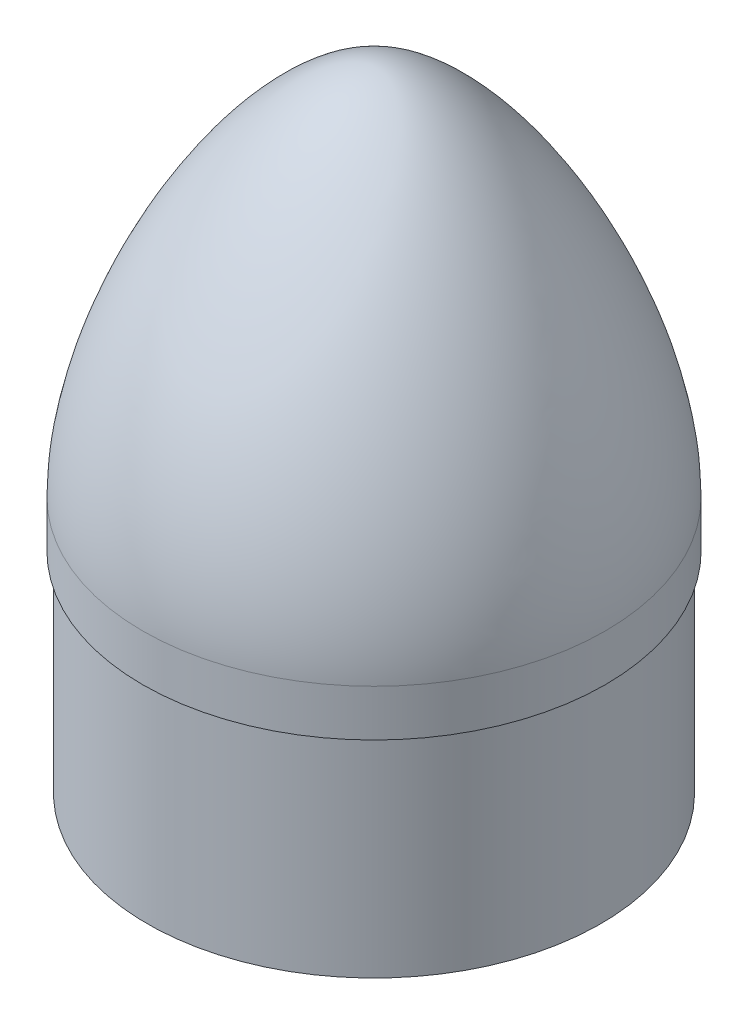
ISO-10303-21;
HEADER;
FILE_DESCRIPTION(('STEP AP214'),'2;1');
FILE_NAME('part.step','',(''),(''),'','','');
FILE_SCHEMA(('AUTOMOTIVE_DESIGN { 1 0 10303 214 1 1 1 1 }'));
ENDSEC;
DATA;
#1=APPLICATION_CONTEXT('core data for automotive mechanical design processes');
#2=APPLICATION_PROTOCOL_DEFINITION('international standard','automotive_design',2000,#1);
#3=PRODUCT_CONTEXT('',#1,'mechanical');
#4=PRODUCT('Part','Part','',(#3));
#5=PRODUCT_RELATED_PRODUCT_CATEGORY('part','',(#4));
#6=PRODUCT_DEFINITION_FORMATION('','',#4);
#7=PRODUCT_DEFINITION_CONTEXT('part definition',#1,'design');
#8=PRODUCT_DEFINITION('design','',#6,#7);
#9=PRODUCT_DEFINITION_SHAPE('','',#8);
#10=(LENGTH_UNIT() NAMED_UNIT(*) SI_UNIT(.MILLI.,.METRE.));
#11=(NAMED_UNIT(*) PLANE_ANGLE_UNIT() SI_UNIT($,.RADIAN.));
#12=(NAMED_UNIT(*) SI_UNIT($,.STERADIAN.) SOLID_ANGLE_UNIT());
#13=UNCERTAINTY_MEASURE_WITH_UNIT(LENGTH_MEASURE(1.E-05),#10,'distance_accuracy_value','');
#14=(GEOMETRIC_REPRESENTATION_CONTEXT(3) GLOBAL_UNCERTAINTY_ASSIGNED_CONTEXT((#13)) GLOBAL_UNIT_ASSIGNED_CONTEXT((#10,
#11,#12)) REPRESENTATION_CONTEXT('',''));
#15=CARTESIAN_POINT('',(0.,0.,0.));
#16=DIRECTION('',(0.,0.,1.));
#17=DIRECTION('',(1.,0.,0.));
#18=AXIS2_PLACEMENT_3D('',#15,#16,#17);
#19=CARTESIAN_POINT('',(-24.3478600957646,27.8393212982698,0.));
#20=CARTESIAN_POINT('',(-24.3414997113521,28.3460105532486,0.));
#21=CARTESIAN_POINT('',(-24.3016388325864,29.3485779649372,0.));
#22=CARTESIAN_POINT('',(-24.1158072803861,31.4318454618947,0.));
#23=CARTESIAN_POINT('',(-23.6931384789774,34.1082295346281,0.));
#24=CARTESIAN_POINT('',(-22.9070651137298,37.4074468602552,0.));
#25=CARTESIAN_POINT('',(-21.5228737091641,41.8546892857655,0.));
#26=CARTESIAN_POINT('',(-19.2301518833451,47.3921397382636,0.));
#27=CARTESIAN_POINT('',(-15.7988297499191,53.635971479426,0.));
#28=CARTESIAN_POINT('',(-11.9110093117972,59.1150642814052,0.));
#29=CARTESIAN_POINT('',(-8.48121615369774,62.7397553171536,0.));
#30=CARTESIAN_POINT('',(-5.74701573311542,64.8929955493382,0.));
#31=CARTESIAN_POINT('',(-3.73464076708142,66.0907602092129,0.));
#32=CARTESIAN_POINT('',(-2.12409342091839,66.7077991405744,0.));
#33=CARTESIAN_POINT('',(-0.885893826213247,66.9577998041921,0.));
#34=CARTESIAN_POINT('',(-0.298692976328732,67.,0.));
#35=CARTESIAN_POINT('',(0.,67.,0.));
#36=B_SPLINE_CURVE_WITH_KNOTS('',3,(#19,#20,#21,#22,#23,#24,#25,#26,#27,#28,#29,#30,#31,#32,#33,
#34,#35),.UNSPECIFIED.,.F.,.F.,(4,1,1,1,1,1,1,1,1,1,1,1,1,1,4),(0.00705350906116208,
0.0380830869030008,0.0691126647448395,0.131171820428517,0.193230976112194,0.255290131795872,
0.379408443163226,0.503526754530581,0.627645065897936,0.751763377265291,0.813822532948968,
0.875881688632645,0.937940844316323,0.968970422158161,1.),.UNSPECIFIED.);
#37=CARTESIAN_POINT('',(0.,0.,0.));
#38=DIRECTION('',(0.,-1.,0.));
#39=AXIS1_PLACEMENT('',#37,#38);
#40=SURFACE_OF_REVOLUTION('',#36,#39);
#41=CARTESIAN_POINT('',(0.,67.,0.));
#42=VERTEX_POINT('',#41);
#43=VERTEX_LOOP('',#42);
#44=FACE_BOUND('',#43,.T.);
#45=CARTESIAN_POINT('',(0.,27.8393212982698,0.));
#46=DIRECTION('',(0.,-1.,0.));
#47=DIRECTION('',(0.,0.,-1.));
#48=AXIS2_PLACEMENT_3D('',#45,#46,#47);
#49=CIRCLE('',#48,24.3478600957646);
#50=CARTESIAN_POINT('',(0.,27.8393212982698,-24.3478600957646));
#51=VERTEX_POINT('',#50);
#52=EDGE_CURVE('E59',#51,#51,#49,.T.);
#53=ORIENTED_EDGE('',*,*,#52,.T.);
#54=EDGE_LOOP('',(#53));
#55=FACE_BOUND('',#54,.T.);
#56=ADVANCED_FACE('F39',(#44,#55),#40,.T.);
#57=CARTESIAN_POINT('',(-24.85,27.5,0.));
#58=CARTESIAN_POINT('',(-24.85,43.7802064437128,0.));
#59=CARTESIAN_POINT('',(-10.2040775450128,67.5,0.));
#60=CARTESIAN_POINT('',(0.,67.5,0.));
#61=B_SPLINE_CURVE_WITH_KNOTS('',3,(#57,#58,#59,#60),.UNSPECIFIED.,.F.,.F.,(4,4),(0.,1.),.UNSPECIFIED.);
#62=CARTESIAN_POINT('',(0.,0.,0.));
#63=DIRECTION('',(0.,-1.,0.));
#64=AXIS1_PLACEMENT('',#62,#63);
#65=SURFACE_OF_REVOLUTION('',#61,#64);
#66=CARTESIAN_POINT('',(0.,67.5,0.));
#67=VERTEX_POINT('',#66);
#68=VERTEX_LOOP('',#67);
#69=FACE_BOUND('',#68,.T.);
#70=CARTESIAN_POINT('',(0.,27.5,0.));
#71=DIRECTION('',(0.,-1.,0.));
#72=DIRECTION('',(0.,0.,-1.));
#73=AXIS2_PLACEMENT_3D('',#70,#71,#72);
#74=CIRCLE('',#73,24.85);
#75=CARTESIAN_POINT('',(0.,27.5,-24.85));
#76=VERTEX_POINT('',#75);
#77=EDGE_CURVE('E11',#76,#76,#74,.T.);
#78=ORIENTED_EDGE('',*,*,#77,.F.);
#79=EDGE_LOOP('',(#78));
#80=FACE_BOUND('',#79,.T.);
#81=ADVANCED_FACE('F56',(#69,#80),#65,.F.);
#82=CARTESIAN_POINT('',(0.,0.,0.));
#83=DIRECTION('',(0.,-1.,0.));
#84=DIRECTION('',(0.,0.,-1.));
#85=AXIS2_PLACEMENT_3D('',#82,#83,#84);
#86=CYLINDRICAL_SURFACE('',#85,24.85);
#87=ORIENTED_EDGE('',*,*,#77,.T.);
#88=EDGE_LOOP('',(#87));
#89=FACE_BOUND('',#88,.T.);
#90=CARTESIAN_POINT('',(0.,22.5,0.));
#91=DIRECTION('',(0.,-1.,0.));
#92=DIRECTION('',(0.,0.,-1.));
#93=AXIS2_PLACEMENT_3D('',#90,#91,#92);
#94=CIRCLE('',#93,24.85);
#95=CARTESIAN_POINT('',(0.,22.5,-24.85));
#96=VERTEX_POINT('',#95);
#97=EDGE_CURVE('E48',#96,#96,#94,.T.);
#98=ORIENTED_EDGE('',*,*,#97,.F.);
#99=EDGE_LOOP('',(#98));
#100=FACE_BOUND('',#99,.T.);
#101=ADVANCED_FACE('F98',(#89,#100),#86,.T.);
#102=CARTESIAN_POINT('',(-24.35,22.5,0.));
#103=DIRECTION('',(0.,-1.,0.));
#104=DIRECTION('',(0.,0.,-1.));
#105=AXIS2_PLACEMENT_3D('',#102,#103,#104);
#106=PLANE('',#105);
#107=ORIENTED_EDGE('',*,*,#97,.T.);
#108=EDGE_LOOP('',(#107));
#109=FACE_BOUND('',#108,.T.);
#110=CARTESIAN_POINT('',(0.,22.5,0.));
#111=DIRECTION('',(0.,-1.,0.));
#112=DIRECTION('',(0.,0.,-1.));
#113=AXIS2_PLACEMENT_3D('',#110,#111,#112);
#114=CIRCLE('',#113,24.35);
#115=CARTESIAN_POINT('',(0.,22.5,-24.35));
#116=VERTEX_POINT('',#115);
#117=EDGE_CURVE('E88',#116,#116,#114,.T.);
#118=ORIENTED_EDGE('',*,*,#117,.F.);
#119=EDGE_LOOP('',(#118));
#120=FACE_BOUND('',#119,.T.);
#121=ADVANCED_FACE('F95',(#109,#120),#106,.T.);
#122=CARTESIAN_POINT('',(0.,0.,0.));
#123=DIRECTION('',(0.,-1.,0.));
#124=DIRECTION('',(0.,0.,-1.));
#125=AXIS2_PLACEMENT_3D('',#122,#123,#124);
#126=CYLINDRICAL_SURFACE('',#125,24.35);
#127=ORIENTED_EDGE('',*,*,#117,.T.);
#128=EDGE_LOOP('',(#127));
#129=FACE_BOUND('',#128,.T.);
#130=CARTESIAN_POINT('',(0.,0.,0.));
#131=DIRECTION('',(0.,-1.,0.));
#132=DIRECTION('',(0.,0.,-1.));
#133=AXIS2_PLACEMENT_3D('',#130,#131,#132);
#134=CIRCLE('',#133,24.35);
#135=CARTESIAN_POINT('',(0.,0.,-24.35));
#136=VERTEX_POINT('',#135);
#137=EDGE_CURVE('E84',#136,#136,#134,.T.);
#138=ORIENTED_EDGE('',*,*,#137,.F.);
#139=EDGE_LOOP('',(#138));
#140=FACE_BOUND('',#139,.T.);
#141=ADVANCED_FACE('F106',(#129,#140),#126,.T.);
#142=CARTESIAN_POINT('',(-24.35,0.,0.));
#143=DIRECTION('',(0.,1.,0.));
#144=DIRECTION('',(0.,0.,1.));
#145=AXIS2_PLACEMENT_3D('',#142,#143,#144);
#146=PLANE('',#145);
#147=CARTESIAN_POINT('',(0.,0.,0.));
#148=DIRECTION('',(0.,-1.,0.));
#149=DIRECTION('',(0.,0.,-1.));
#150=AXIS2_PLACEMENT_3D('',#147,#148,#149);
#151=CIRCLE('',#150,23.85);
#152=CARTESIAN_POINT('',(0.,0.,-23.85));
#153=VERTEX_POINT('',#152);
#154=EDGE_CURVE('E80',#153,#153,#151,.T.);
#155=ORIENTED_EDGE('',*,*,#154,.F.);
#156=EDGE_LOOP('',(#155));
#157=FACE_BOUND('',#156,.T.);
#158=ORIENTED_EDGE('',*,*,#137,.T.);
#159=EDGE_LOOP('',(#158));
#160=FACE_BOUND('',#159,.T.);
#161=ADVANCED_FACE('F111',(#157,#160),#146,.F.);
#162=CARTESIAN_POINT('',(0.,0.,0.));
#163=DIRECTION('',(0.,-1.,0.));
#164=DIRECTION('',(0.,0.,-1.));
#165=AXIS2_PLACEMENT_3D('',#162,#163,#164);
#166=CYLINDRICAL_SURFACE('',#165,23.85);
#167=CARTESIAN_POINT('',(0.,23.,0.));
#168=DIRECTION('',(0.,-1.,0.));
#169=DIRECTION('',(0.,0.,-1.));
#170=AXIS2_PLACEMENT_3D('',#167,#168,#169);
#171=CIRCLE('',#170,23.85);
#172=CARTESIAN_POINT('',(0.,23.,-23.85));
#173=VERTEX_POINT('',#172);
#174=EDGE_CURVE('E76',#173,#173,#171,.T.);
#175=ORIENTED_EDGE('',*,*,#174,.F.);
#176=EDGE_LOOP('',(#175));
#177=FACE_BOUND('',#176,.T.);
#178=ORIENTED_EDGE('',*,*,#154,.T.);
#179=EDGE_LOOP('',(#178));
#180=FACE_BOUND('',#179,.T.);
#181=ADVANCED_FACE('F115',(#177,#180),#166,.F.);
#182=CARTESIAN_POINT('',(-23.85,23.,0.));
#183=DIRECTION('',(0.,-1.,0.));
#184=DIRECTION('',(0.,0.,-1.));
#185=AXIS2_PLACEMENT_3D('',#182,#183,#184);
#186=PLANE('',#185);
#187=CARTESIAN_POINT('',(0.,23.,0.));
#188=DIRECTION('',(0.,-1.,0.));
#189=DIRECTION('',(0.,0.,-1.));
#190=AXIS2_PLACEMENT_3D('',#187,#188,#189);
#191=CIRCLE('',#190,24.35);
#192=CARTESIAN_POINT('',(0.,23.,-24.35));
#193=VERTEX_POINT('',#192);
#194=EDGE_CURVE('E66',#193,#193,#191,.T.);
#195=ORIENTED_EDGE('',*,*,#194,.F.);
#196=EDGE_LOOP('',(#195));
#197=FACE_BOUND('',#196,.T.);
#198=ORIENTED_EDGE('',*,*,#174,.T.);
#199=EDGE_LOOP('',(#198));
#200=FACE_BOUND('',#199,.T.);
#201=ADVANCED_FACE('F119',(#197,#200),#186,.F.);
#202=CARTESIAN_POINT('',(0.,0.,0.));
#203=DIRECTION('',(0.,-1.,0.));
#204=DIRECTION('',(0.,0.,-1.));
#205=AXIS2_PLACEMENT_3D('',#202,#203,#204);
#206=CYLINDRICAL_SURFACE('',#205,24.35);
#207=CARTESIAN_POINT('',(0.,27.3393258774809,0.));
#208=DIRECTION('',(0.,-1.,0.));
#209=DIRECTION('',(0.,0.,-1.));
#210=AXIS2_PLACEMENT_3D('',#207,#208,#209);
#211=CIRCLE('',#210,24.35);
#212=CARTESIAN_POINT('',(0.,27.3393258774809,-24.35));
#213=VERTEX_POINT('',#212);
#214=EDGE_CURVE('E62',#213,#213,#211,.T.);
#215=ORIENTED_EDGE('',*,*,#214,.F.);
#216=EDGE_LOOP('',(#215));
#217=FACE_BOUND('',#216,.T.);
#218=ORIENTED_EDGE('',*,*,#194,.T.);
#219=EDGE_LOOP('',(#218));
#220=FACE_BOUND('',#219,.T.);
#221=ADVANCED_FACE('F123',(#217,#220),#206,.F.);
#222=CARTESIAN_POINT('',(0.,27.3393258774809,0.));
#223=DIRECTION('',(0.,-1.,0.));
#224=DIRECTION('',(0.,0.,-1.));
#225=AXIS2_PLACEMENT_3D('',#222,#223,#224);
#226=CONICAL_SURFACE('',#225,24.35,0.00427982153635531);
#227=ORIENTED_EDGE('',*,*,#52,.F.);
#228=EDGE_LOOP('',(#227));
#229=FACE_BOUND('',#228,.T.);
#230=ORIENTED_EDGE('',*,*,#214,.T.);
#231=EDGE_LOOP('',(#230));
#232=FACE_BOUND('',#231,.T.);
#233=ADVANCED_FACE('F127',(#229,#232),#226,.F.);
#234=CLOSED_SHELL('',(#56,#81,#101,#121,#141,#161,#181,#201,#221,#233));
#235=MANIFOLD_SOLID_BREP('B2',#234);
#236=ADVANCED_BREP_SHAPE_REPRESENTATION('',(#18,#235),#14);
#237=SHAPE_DEFINITION_REPRESENTATION(#9,#236);
ENDSEC;
END-ISO-10303-21;
